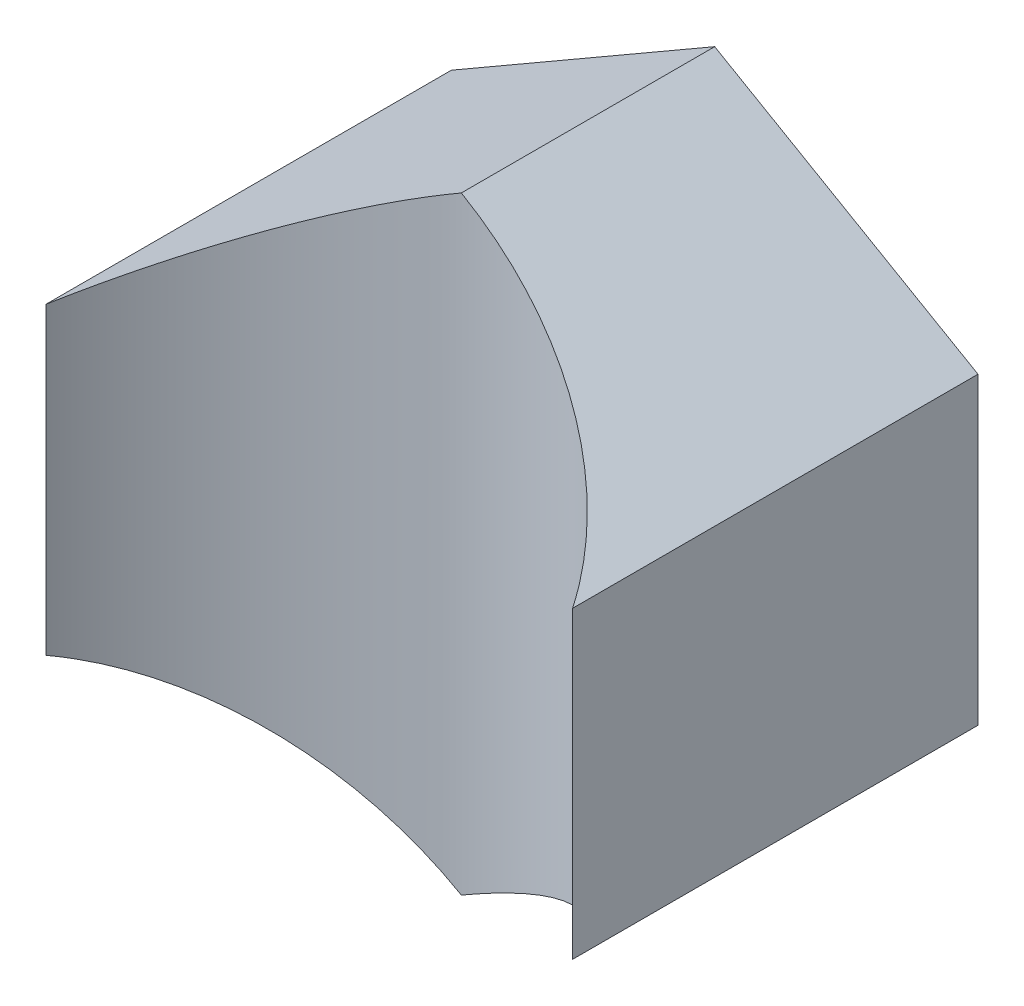
ISO-10303-21;
HEADER;
FILE_DESCRIPTION(('STEP AP214'),'2;1');
FILE_NAME('part.step','',(''),(''),'','','');
FILE_SCHEMA(('AUTOMOTIVE_DESIGN { 1 0 10303 214 1 1 1 1 }'));
ENDSEC;
DATA;
#1=APPLICATION_CONTEXT('core data for automotive mechanical design processes');
#2=APPLICATION_PROTOCOL_DEFINITION('international standard','automotive_design',2000,#1);
#3=PRODUCT_CONTEXT('',#1,'mechanical');
#4=PRODUCT('Part','Part','',(#3));
#5=PRODUCT_RELATED_PRODUCT_CATEGORY('part','',(#4));
#6=PRODUCT_DEFINITION_FORMATION('','',#4);
#7=PRODUCT_DEFINITION_CONTEXT('part definition',#1,'design');
#8=PRODUCT_DEFINITION('design','',#6,#7);
#9=PRODUCT_DEFINITION_SHAPE('','',#8);
#10=(LENGTH_UNIT() NAMED_UNIT(*) SI_UNIT(.MILLI.,.METRE.));
#11=(NAMED_UNIT(*) PLANE_ANGLE_UNIT() SI_UNIT($,.RADIAN.));
#12=(NAMED_UNIT(*) SI_UNIT($,.STERADIAN.) SOLID_ANGLE_UNIT());
#13=UNCERTAINTY_MEASURE_WITH_UNIT(LENGTH_MEASURE(1.E-05),#10,'distance_accuracy_value','');
#14=(GEOMETRIC_REPRESENTATION_CONTEXT(3) GLOBAL_UNCERTAINTY_ASSIGNED_CONTEXT((#13)) GLOBAL_UNIT_ASSIGNED_CONTEXT((#10,
#11,#12)) REPRESENTATION_CONTEXT('',''));
#15=CARTESIAN_POINT('',(0.,0.,0.));
#16=DIRECTION('',(0.,0.,1.));
#17=DIRECTION('',(1.,0.,0.));
#18=AXIS2_PLACEMENT_3D('',#15,#16,#17);
#19=CARTESIAN_POINT('',(0.,7.5,10.));
#20=DIRECTION('',(0.5,-0.866025403784439,0.));
#21=DIRECTION('',(0.866025403784439,0.5,0.));
#22=AXIS2_PLACEMENT_3D('',#19,#20,#21);
#23=PLANE('',#22);
#24=DIRECTION('',(0.,0.,-1.));
#25=VECTOR('',#24,1.);
#26=CARTESIAN_POINT('',(-6.49519052838329,3.75,10.));
#27=LINE('',#26,#25);
#28=CARTESIAN_POINT('',(-6.49519052838329,3.75,10.));
#29=VERTEX_POINT('',#28);
#30=CARTESIAN_POINT('',(-6.49519052838329,3.75,0.));
#31=VERTEX_POINT('',#30);
#32=EDGE_CURVE('E11',#29,#31,#27,.T.);
#33=ORIENTED_EDGE('',*,*,#32,.F.);
#34=CARTESIAN_POINT('',(0.,7.5,13.75));
#35=DIRECTION('',(0.5,-0.866025403784439,0.));
#36=DIRECTION('',(0.866025403784439,0.5,0.));
#37=AXIS2_PLACEMENT_3D('',#34,#35,#36);
#38=ELLIPSE('',#37,8.66025403784439,7.5);
#39=CARTESIAN_POINT('',(0.,7.5,6.25));
#40=VERTEX_POINT('',#39);
#41=EDGE_CURVE('E64',#29,#40,#38,.T.);
#42=ORIENTED_EDGE('',*,*,#41,.T.);
#43=DIRECTION('',(0.,0.,-1.));
#44=VECTOR('',#43,1.);
#45=CARTESIAN_POINT('',(0.,7.5,10.));
#46=LINE('',#45,#44);
#47=CARTESIAN_POINT('',(0.,7.5,0.));
#48=VERTEX_POINT('',#47);
#49=EDGE_CURVE('E107',#40,#48,#46,.T.);
#50=ORIENTED_EDGE('',*,*,#49,.T.);
#51=DIRECTION('',(-0.866025403784439,-0.5,0.));
#52=VECTOR('',#51,1.);
#53=CARTESIAN_POINT('',(0.,7.5,0.));
#54=LINE('',#53,#52);
#55=EDGE_CURVE('E115',#48,#31,#54,.T.);
#56=ORIENTED_EDGE('',*,*,#55,.T.);
#57=EDGE_LOOP('',(#33,#42,#50,#56));
#58=FACE_BOUND('',#57,.T.);
#59=ADVANCED_FACE('F44',(#58),#23,.F.);
#60=CARTESIAN_POINT('',(-6.49519052838329,3.75,10.));
#61=DIRECTION('',(1.,0.,0.));
#62=DIRECTION('',(0.,1.,0.));
#63=AXIS2_PLACEMENT_3D('',#60,#61,#62);
#64=PLANE('',#63);
#65=DIRECTION('',(0.,-1.,0.));
#66=VECTOR('',#65,1.);
#67=CARTESIAN_POINT('',(-6.49519052838329,3.75,0.));
#68=LINE('',#67,#66);
#69=CARTESIAN_POINT('',(-6.49519052838329,-3.75,0.));
#70=VERTEX_POINT('',#69);
#71=EDGE_CURVE('E143',#31,#70,#68,.T.);
#72=ORIENTED_EDGE('',*,*,#71,.T.);
#73=DIRECTION('',(0.,0.,-1.));
#74=VECTOR('',#73,1.);
#75=CARTESIAN_POINT('',(-6.49519052838329,-3.75,10.));
#76=LINE('',#75,#74);
#77=CARTESIAN_POINT('',(-6.49519052838329,-3.74999999999999,10.));
#78=VERTEX_POINT('',#77);
#79=EDGE_CURVE('E53',#78,#70,#76,.T.);
#80=ORIENTED_EDGE('',*,*,#79,.F.);
#81=DIRECTION('',(0.,-1.,0.));
#82=VECTOR('',#81,1.);
#83=CARTESIAN_POINT('',(-6.49519052838329,3.75,10.));
#84=LINE('',#83,#82);
#85=EDGE_CURVE('E111',#29,#78,#84,.T.);
#86=ORIENTED_EDGE('',*,*,#85,.F.);
#87=ORIENTED_EDGE('',*,*,#32,.T.);
#88=EDGE_LOOP('',(#72,#80,#86,#87));
#89=FACE_BOUND('',#88,.T.);
#90=ADVANCED_FACE('F171',(#89),#64,.F.);
#91=CARTESIAN_POINT('',(-6.49519052838329,-3.75,10.));
#92=DIRECTION('',(0.5,0.866025403784439,0.));
#93=DIRECTION('',(-0.866025403784439,0.5,0.));
#94=AXIS2_PLACEMENT_3D('',#91,#92,#93);
#95=PLANE('',#94);
#96=DIRECTION('',(0.,0.,-1.));
#97=VECTOR('',#96,1.);
#98=CARTESIAN_POINT('',(0.,-7.49999999999999,10.));
#99=LINE('',#98,#97);
#100=CARTESIAN_POINT('',(0.,-7.49999999999999,6.25));
#101=VERTEX_POINT('',#100);
#102=CARTESIAN_POINT('',(0.,-7.49999999999999,0.));
#103=VERTEX_POINT('',#102);
#104=EDGE_CURVE('E121',#101,#103,#99,.T.);
#105=ORIENTED_EDGE('',*,*,#104,.F.);
#106=CARTESIAN_POINT('',(0.,-7.5,13.75));
#107=DIRECTION('',(0.5,0.866025403784439,0.));
#108=DIRECTION('',(-0.866025403784439,0.5,0.));
#109=AXIS2_PLACEMENT_3D('',#106,#107,#108);
#110=ELLIPSE('',#109,8.66025403784439,7.5);
#111=EDGE_CURVE('E139',#101,#78,#110,.T.);
#112=ORIENTED_EDGE('',*,*,#111,.T.);
#113=ORIENTED_EDGE('',*,*,#79,.T.);
#114=DIRECTION('',(0.866025403784439,-0.5,0.));
#115=VECTOR('',#114,1.);
#116=CARTESIAN_POINT('',(-6.49519052838329,-3.75,0.));
#117=LINE('',#116,#115);
#118=EDGE_CURVE('E137',#70,#103,#117,.T.);
#119=ORIENTED_EDGE('',*,*,#118,.T.);
#120=EDGE_LOOP('',(#105,#112,#113,#119));
#121=FACE_BOUND('',#120,.T.);
#122=ADVANCED_FACE('F132',(#121),#95,.F.);
#123=CARTESIAN_POINT('',(0.,-7.49999999999999,10.));
#124=DIRECTION('',(-0.5,0.866025403784439,0.));
#125=DIRECTION('',(-0.866025403784439,-0.5,0.));
#126=AXIS2_PLACEMENT_3D('',#123,#124,#125);
#127=PLANE('',#126);
#128=DIRECTION('',(0.,0.,-1.));
#129=VECTOR('',#128,1.);
#130=CARTESIAN_POINT('',(6.49519052838329,-3.75,10.));
#131=LINE('',#130,#129);
#132=CARTESIAN_POINT('',(6.49519052838329,-3.75,9.99999999999999));
#133=VERTEX_POINT('',#132);
#134=CARTESIAN_POINT('',(6.49519052838329,-3.75,0.));
#135=VERTEX_POINT('',#134);
#136=EDGE_CURVE('E95',#133,#135,#131,.T.);
#137=ORIENTED_EDGE('',*,*,#136,.F.);
#138=CARTESIAN_POINT('',(0.,-7.49999999999999,13.75));
#139=DIRECTION('',(-0.5,0.866025403784439,0.));
#140=DIRECTION('',(0.866025403784439,0.5,0.));
#141=AXIS2_PLACEMENT_3D('',#138,#139,#140);
#142=ELLIPSE('',#141,8.66025403784439,7.5);
#143=EDGE_CURVE('E160',#133,#101,#142,.T.);
#144=ORIENTED_EDGE('',*,*,#143,.T.);
#145=ORIENTED_EDGE('',*,*,#104,.T.);
#146=DIRECTION('',(0.866025403784439,0.5,0.));
#147=VECTOR('',#146,1.);
#148=CARTESIAN_POINT('',(0.,-7.49999999999999,0.));
#149=LINE('',#148,#147);
#150=EDGE_CURVE('E98',#103,#135,#149,.T.);
#151=ORIENTED_EDGE('',*,*,#150,.T.);
#152=EDGE_LOOP('',(#137,#144,#145,#151));
#153=FACE_BOUND('',#152,.T.);
#154=ADVANCED_FACE('F164',(#153),#127,.F.);
#155=CARTESIAN_POINT('',(6.49519052838329,-3.75,10.));
#156=DIRECTION('',(-1.,0.,0.));
#157=DIRECTION('',(0.,-1.,0.));
#158=AXIS2_PLACEMENT_3D('',#155,#156,#157);
#159=PLANE('',#158);
#160=DIRECTION('',(0.,1.,0.));
#161=VECTOR('',#160,1.);
#162=CARTESIAN_POINT('',(6.49519052838329,-3.75,0.));
#163=LINE('',#162,#161);
#164=CARTESIAN_POINT('',(6.49519052838329,3.75,0.));
#165=VERTEX_POINT('',#164);
#166=EDGE_CURVE('E81',#135,#165,#163,.T.);
#167=ORIENTED_EDGE('',*,*,#166,.T.);
#168=DIRECTION('',(0.,0.,-1.));
#169=VECTOR('',#168,1.);
#170=CARTESIAN_POINT('',(6.49519052838329,3.75,10.));
#171=LINE('',#170,#169);
#172=CARTESIAN_POINT('',(6.49519052838329,3.75,10.));
#173=VERTEX_POINT('',#172);
#174=EDGE_CURVE('E89',#173,#165,#171,.T.);
#175=ORIENTED_EDGE('',*,*,#174,.F.);
#176=DIRECTION('',(0.,1.,0.));
#177=VECTOR('',#176,1.);
#178=CARTESIAN_POINT('',(6.49519052838329,-3.75,10.));
#179=LINE('',#178,#177);
#180=EDGE_CURVE('E116',#133,#173,#179,.T.);
#181=ORIENTED_EDGE('',*,*,#180,.F.);
#182=ORIENTED_EDGE('',*,*,#136,.T.);
#183=EDGE_LOOP('',(#167,#175,#181,#182));
#184=FACE_BOUND('',#183,.T.);
#185=ADVANCED_FACE('F87',(#184),#159,.F.);
#186=CARTESIAN_POINT('',(6.49519052838329,3.75,10.));
#187=DIRECTION('',(-0.5,-0.866025403784439,0.));
#188=DIRECTION('',(0.866025403784439,-0.5,0.));
#189=AXIS2_PLACEMENT_3D('',#186,#187,#188);
#190=PLANE('',#189);
#191=ORIENTED_EDGE('',*,*,#49,.F.);
#192=CARTESIAN_POINT('',(0.,7.5,13.75));
#193=DIRECTION('',(-0.5,-0.866025403784439,0.));
#194=DIRECTION('',(-0.866025403784439,0.5,0.));
#195=AXIS2_PLACEMENT_3D('',#192,#193,#194);
#196=ELLIPSE('',#195,8.66025403784439,7.5);
#197=EDGE_CURVE('E106',#40,#173,#196,.T.);
#198=ORIENTED_EDGE('',*,*,#197,.T.);
#199=ORIENTED_EDGE('',*,*,#174,.T.);
#200=DIRECTION('',(-0.866025403784438,0.5,0.));
#201=VECTOR('',#200,1.);
#202=CARTESIAN_POINT('',(6.49519052838329,3.75,0.));
#203=LINE('',#202,#201);
#204=EDGE_CURVE('E100',#165,#48,#203,.T.);
#205=ORIENTED_EDGE('',*,*,#204,.T.);
#206=EDGE_LOOP('',(#191,#198,#199,#205));
#207=FACE_BOUND('',#206,.T.);
#208=ADVANCED_FACE('F102',(#207),#190,.F.);
#209=CARTESIAN_POINT('',(0.,0.,0.));
#210=DIRECTION('',(0.,0.,1.));
#211=DIRECTION('',(1.,0.,0.));
#212=AXIS2_PLACEMENT_3D('',#209,#210,#211);
#213=PLANE('',#212);
#214=ORIENTED_EDGE('',*,*,#55,.F.);
#215=ORIENTED_EDGE('',*,*,#204,.F.);
#216=ORIENTED_EDGE('',*,*,#166,.F.);
#217=ORIENTED_EDGE('',*,*,#150,.F.);
#218=ORIENTED_EDGE('',*,*,#118,.F.);
#219=ORIENTED_EDGE('',*,*,#71,.F.);
#220=EDGE_LOOP('',(#214,#215,#216,#217,#218,#219));
#221=FACE_BOUND('',#220,.T.);
#222=ADVANCED_FACE('F109',(#221),#213,.F.);
#223=CARTESIAN_POINT('',(0.,-13.5,13.75));
#224=DIRECTION('',(0.,1.,0.));
#225=DIRECTION('',(0.,0.,1.));
#226=AXIS2_PLACEMENT_3D('',#223,#224,#225);
#227=CYLINDRICAL_SURFACE('',#226,7.5);
#228=ORIENTED_EDGE('',*,*,#85,.T.);
#229=ORIENTED_EDGE('',*,*,#111,.F.);
#230=ORIENTED_EDGE('',*,*,#143,.F.);
#231=ORIENTED_EDGE('',*,*,#180,.T.);
#232=ORIENTED_EDGE('',*,*,#197,.F.);
#233=ORIENTED_EDGE('',*,*,#41,.F.);
#234=EDGE_LOOP('',(#228,#229,#230,#231,#232,#233));
#235=FACE_BOUND('',#234,.T.);
#236=ADVANCED_FACE('F169',(#235),#227,.F.);
#237=CLOSED_SHELL('',(#59,#90,#122,#154,#185,#208,#222,#236));
#238=MANIFOLD_SOLID_BREP('B2',#237);
#239=ADVANCED_BREP_SHAPE_REPRESENTATION('',(#18,#238),#14);
#240=SHAPE_DEFINITION_REPRESENTATION(#9,#239);
ENDSEC;
END-ISO-10303-21;
